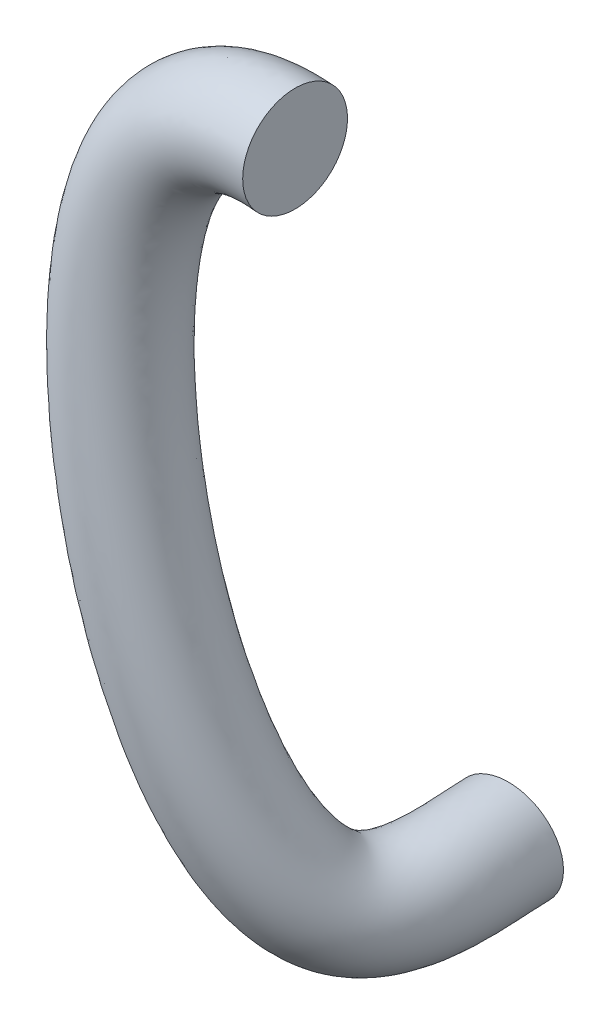
ISO-10303-21;
HEADER;
FILE_DESCRIPTION(('STEP AP214'),'2;1');
FILE_NAME('part.step','',(''),(''),'','','');
FILE_SCHEMA(('AUTOMOTIVE_DESIGN { 1 0 10303 214 1 1 1 1 }'));
ENDSEC;
DATA;
#1=APPLICATION_CONTEXT('core data for automotive mechanical design processes');
#2=APPLICATION_PROTOCOL_DEFINITION('international standard','automotive_design',2000,#1);
#3=PRODUCT_CONTEXT('',#1,'mechanical');
#4=PRODUCT('Part','Part','',(#3));
#5=PRODUCT_RELATED_PRODUCT_CATEGORY('part','',(#4));
#6=PRODUCT_DEFINITION_FORMATION('','',#4);
#7=PRODUCT_DEFINITION_CONTEXT('part definition',#1,'design');
#8=PRODUCT_DEFINITION('design','',#6,#7);
#9=PRODUCT_DEFINITION_SHAPE('','',#8);
#10=(LENGTH_UNIT() NAMED_UNIT(*) SI_UNIT(.MILLI.,.METRE.));
#11=(NAMED_UNIT(*) PLANE_ANGLE_UNIT() SI_UNIT($,.RADIAN.));
#12=(NAMED_UNIT(*) SI_UNIT($,.STERADIAN.) SOLID_ANGLE_UNIT());
#13=UNCERTAINTY_MEASURE_WITH_UNIT(LENGTH_MEASURE(1.E-05),#10,'distance_accuracy_value','');
#14=(GEOMETRIC_REPRESENTATION_CONTEXT(3) GLOBAL_UNCERTAINTY_ASSIGNED_CONTEXT((#13)) GLOBAL_UNIT_ASSIGNED_CONTEXT((#10,
#11,#12)) REPRESENTATION_CONTEXT('',''));
#15=CARTESIAN_POINT('',(0.,0.,0.));
#16=DIRECTION('',(0.,0.,1.));
#17=DIRECTION('',(1.,0.,0.));
#18=AXIS2_PLACEMENT_3D('',#15,#16,#17);
#19=CARTESIAN_POINT('',(6.71129752115392,160.69883508854,46.8977238091233));
#20=DIRECTION('',(-1.,0.,0.));
#21=DIRECTION('',(0.,0.,1.));
#22=AXIS2_PLACEMENT_3D('',#19,#20,#21);
#23=PLANE('',#22);
#24=CARTESIAN_POINT('',(6.71129752115392,160.69883508854,46.8977238091233));
#25=DIRECTION('',(-1.,0.,0.));
#26=DIRECTION('',(0.,0.,1.));
#27=AXIS2_PLACEMENT_3D('',#24,#25,#26);
#28=CIRCLE('',#27,12.0386692168077);
#29=CARTESIAN_POINT('',(6.71129752115392,160.69883508854,58.936393025931));
#30=VERTEX_POINT('',#29);
#31=EDGE_CURVE('E50',#30,#30,#28,.T.);
#32=ORIENTED_EDGE('',*,*,#31,.F.);
#33=EDGE_LOOP('',(#32));
#34=FACE_BOUND('',#33,.T.);
#35=ADVANCED_FACE('F43',(#34),#23,.F.);
#36=CARTESIAN_POINT('',(7.74999999999999,0.,-1.00000000000001));
#37=DIRECTION('',(-0.0566041118554589,0.0614817614043295,-0.996501865294629));
#38=DIRECTION('',(0.997108530409179,-0.0472044511668905,-0.0595509729162754));
#39=AXIS2_PLACEMENT_3D('',#36,#37,#38);
#40=PLANE('',#39);
#41=CARTESIAN_POINT('',(7.74999999999999,0.,-1.00000000000001));
#42=DIRECTION('',(-0.0566041118554589,0.0614817614043295,-0.996501865294629));
#43=DIRECTION('',(0.997108530409179,-0.0472044511668905,-0.0595509729162754));
#44=AXIS2_PLACEMENT_3D('',#41,#42,#43);
#45=CIRCLE('',#44,12.0386692168077);
#46=CARTESIAN_POINT('',(19.7538597708533,-0.568278773159118,-1.71691446447812));
#47=VERTEX_POINT('',#46);
#48=EDGE_CURVE('E13',#47,#47,#45,.T.);
#49=ORIENTED_EDGE('',*,*,#48,.T.);
#50=EDGE_LOOP('',(#49));
#51=FACE_BOUND('',#50,.T.);
#52=ADVANCED_FACE('F57',(#51),#40,.T.);
#53=CARTESIAN_POINT('',(6.71129752115392,160.69883508854,58.936393025931));
#54=CARTESIAN_POINT('',(2.64232080747428,161.001587531297,58.9177532654254));
#55=CARTESIAN_POINT('',(-0.944195238219384,160.721293907481,58.9756862272262));
#56=CARTESIAN_POINT('',(-5.6718689653482,159.56335363344,59.1461284701182));
#57=CARTESIAN_POINT('',(-7.13972168897522,159.054450021098,59.2168769740686));
#58=CARTESIAN_POINT('',(-9.8772485890813,157.808793214191,59.3816605110406));
#59=CARTESIAN_POINT('',(-11.1471131705001,157.07202655243,59.4757031796176));
#60=CARTESIAN_POINT('',(-13.5062232568176,155.38250036498,59.6831303658401));
#61=CARTESIAN_POINT('',(-14.5955700214568,154.429580962221,59.7965380965598));
#62=CARTESIAN_POINT('',(-16.6055529973727,152.316025551618,60.0389033687706));
#63=CARTESIAN_POINT('',(-17.5261267689097,151.155257635872,60.1678764867033));
#64=CARTESIAN_POINT('',(-20.0432382963109,147.376031073605,60.5716612986354));
#65=CARTESIAN_POINT('',(-21.3950606972365,144.458961663299,60.8636890479463));
#66=CARTESIAN_POINT('',(-23.4644206426573,137.952281202509,61.4500236417584));
#67=CARTESIAN_POINT('',(-24.1812303447294,134.363918940176,61.7442982979647));
#68=CARTESIAN_POINT('',(-25.0048657003317,126.670391864419,62.2816280706198));
#69=CARTESIAN_POINT('',(-25.1116271452532,122.56563501956,62.5247966098336));
#70=CARTESIAN_POINT('',(-24.7559396004752,113.999416955435,62.8950814115396));
#71=CARTESIAN_POINT('',(-24.2929173863005,109.538107796792,63.0220869797377));
#72=CARTESIAN_POINT('',(-23.2193305008228,102.69744875354,63.0670577455095));
#73=CARTESIAN_POINT('',(-22.7985367447473,100.392426350218,63.0576877394916));
#74=CARTESIAN_POINT('',(-22.0820834636409,96.9120907128022,62.9996312938717));
#75=CARTESIAN_POINT('',(-21.8290812586597,95.7481741785839,62.9729487750866));
#76=CARTESIAN_POINT('',(-21.4296945264029,93.998343713096,62.9210709684976));
#77=CARTESIAN_POINT('',(-21.2932535502373,93.4144072186789,62.9018034602132));
#78=CARTESIAN_POINT('',(-21.0140018901857,92.2455016144357,62.859186996318));
#79=CARTESIAN_POINT('',(-20.8686806121056,91.6609150278727,62.8342043943215));
#80=CARTESIAN_POINT('',(-20.6172762957058,90.4849092459277,62.8077278712934));
#81=CARTESIAN_POINT('',(-20.5056670156739,89.8941182849446,62.803142377095));
#82=CARTESIAN_POINT('',(-20.3101747641577,88.7063075751386,62.8119672479094));
#83=CARTESIAN_POINT('',(-20.224231059136,88.1095079291619,62.8240895618453));
#84=CARTESIAN_POINT('',(-19.942969211529,86.3189510047645,62.847508717107));
#85=CARTESIAN_POINT('',(-19.7454618103674,85.1221319377536,62.8587970449231));
#86=CARTESIAN_POINT('',(-19.1244893166395,81.5257019487116,62.8787961532288));
#87=CARTESIAN_POINT('',(-18.672544439002,79.1201362122556,62.8736247471147));
#88=CARTESIAN_POINT('',(-17.2150625785129,71.9061104959128,62.7952992215899));
#89=CARTESIAN_POINT('',(-16.1079214553012,67.1005356378372,62.6593941217392));
#90=CARTESIAN_POINT('',(-14.2924545462278,60.0001027152635,62.2999578576404));
#91=CARTESIAN_POINT('',(-13.661500399505,57.6512271364247,62.1542051604453));
#92=CARTESIAN_POINT('',(-12.6822582961877,54.1670922909851,61.892700693688));
#93=CARTESIAN_POINT('',(-12.350382213619,53.0122372909706,61.7983897964768));
#94=CARTESIAN_POINT('',(-11.8450804295128,51.2912416192519,61.6456841397449));
#95=CARTESIAN_POINT('',(-11.6754012769997,50.7194562720621,61.5929106676585));
#96=CARTESIAN_POINT('',(-11.3336658312386,49.5798931556975,61.4835291562504));
#97=CARTESIAN_POINT('',(-11.1669275515516,49.0101055191154,61.4303052896807));
#98=CARTESIAN_POINT('',(-10.794129076821,47.8886979746388,61.2963789945767));
#99=CARTESIAN_POINT('',(-10.5900178993821,47.3364375960552,61.2169344420335));
#100=CARTESIAN_POINT('',(-10.1474051943547,46.2500014930371,61.0321351128052));
#101=CARTESIAN_POINT('',(-9.90688698439704,45.7167298691711,60.9252062465005));
#102=CARTESIAN_POINT('',(-9.20300097861032,44.1185089503149,60.6090155235913));
#103=CARTESIAN_POINT('',(-8.73515207454892,43.0635245386769,60.3902624882489));
#104=CARTESIAN_POINT('',(-7.33729761228388,39.9325650131115,59.710791033785));
#105=CARTESIAN_POINT('',(-6.41307614278082,37.8905676236093,59.2269678777178));
#106=CARTESIAN_POINT('',(-3.67109980976565,31.9212032903064,57.6848269794159));
#107=CARTESIAN_POINT('',(-1.88450603224282,28.1504089561507,56.5376333459812));
#108=CARTESIAN_POINT('',(1.58954049756611,21.1407102593211,53.9729749981893));
#109=CARTESIAN_POINT('',(3.27745801313271,17.9015571939292,52.5557611936432));
#110=CARTESIAN_POINT('',(6.54997904593098,12.0729557091455,49.3607166549214));
#111=CARTESIAN_POINT('',(8.13555519444158,9.48043876956108,47.5831868774322));
#112=CARTESIAN_POINT('',(10.4307207736467,6.19813345901746,44.5245814754007));
#113=CARTESIAN_POINT('',(11.1818714781991,5.20577254863658,43.4388182669825));
#114=CARTESIAN_POINT('',(12.6487392668249,3.46119771602986,41.1129947434454));
#115=CARTESIAN_POINT('',(13.3646156184729,2.70916867674779,39.8722931696288));
#116=CARTESIAN_POINT('',(14.3997516721735,1.79789500154817,37.8862686151673));
#117=CARTESIAN_POINT('',(14.7343322288911,1.50411360450494,37.2107276877292));
#118=CARTESIAN_POINT('',(15.3887638161711,0.989751240801792,35.8156645727013));
#119=CARTESIAN_POINT('',(15.7076958524324,0.766794564098818,35.0978440079401));
#120=CARTESIAN_POINT('',(16.6317830927809,0.189235019122392,32.8914605181011));
#121=CARTESIAN_POINT('',(17.2039917254068,-0.0730817660265249,31.3503702774271));
#122=CARTESIAN_POINT('',(18.7388086702499,-0.60048297299364,26.565419343406));
#123=CARTESIAN_POINT('',(19.5202900948601,-0.606037060771934,23.1625639700975));
#124=CARTESIAN_POINT('',(20.40442080997,-0.550728924787823,15.9117521297618));
#125=CARTESIAN_POINT('',(20.4482876614725,-0.495316130494896,12.3503041893571));
#126=CARTESIAN_POINT('',(20.2411262662305,-0.457696728206301,5.33828913915522));
#127=CARTESIAN_POINT('',(19.9890497435148,-0.473732022411057,1.87545155960961));
#128=CARTESIAN_POINT('',(19.7538597708533,-0.568278773159098,-1.71691446447812));
#129=CARTESIAN_POINT('',(6.71129752115392,184.776173522156,58.936393025931));
#130=CARTESIAN_POINT('',(0.520127182955487,185.078925966144,59.0576790010119));
#131=CARTESIAN_POINT('',(-5.5971530683734,184.511785793862,59.2975121651049));
#132=CARTESIAN_POINT('',(-14.351613598672,182.055200864028,59.8552010561775));
#133=CARTESIAN_POINT('',(-17.1906455425292,180.969399617912,60.0738430610493));
#134=CARTESIAN_POINT('',(-22.5792861409768,178.284777979187,60.5702592365965));
#135=CARTESIAN_POINT('',(-25.1263733460068,176.686285679128,60.8479238509794));
#136=CARTESIAN_POINT('',(-29.8066586200073,173.080149583844,61.4469004284636));
#137=CARTESIAN_POINT('',(-31.9386493226616,171.074719262658,61.7679136709991));
#138=CARTESIAN_POINT('',(-35.7394584768988,166.803240123734,62.4354895744485));
#139=CARTESIAN_POINT('',(-37.4092348954896,164.538895574543,62.7818802046036));
#140=CARTESIAN_POINT('',(-41.7681516038707,157.542573916449,63.8405976965169));
#141=CARTESIAN_POINT('',(-43.8118564895989,152.628623178363,64.5700309947016));
#142=CARTESIAN_POINT('',(-46.6835743277109,142.709728017622,66.0576993580832));
#143=CARTESIAN_POINT('',(-47.5194360395143,137.687174770657,66.8185525407523));
#144=CARTESIAN_POINT('',(-48.3144415260155,127.562730542136,68.391565633612));
#145=CARTESIAN_POINT('',(-48.2699060266349,122.455632733435,69.2049578825947));
#146=CARTESIAN_POINT('',(-47.4228872047436,112.173709798091,70.8837493584787));
#147=CARTESIAN_POINT('',(-46.6170744809587,106.998654838481,71.7504760829907));
#148=CARTESIAN_POINT('',(-44.862297719376,99.233908805138,73.048286499925));
#149=CARTESIAN_POINT('',(-44.1859542729551,96.6456578014202,73.479930277028));
#150=CARTESIAN_POINT('',(-43.037564866358,92.7718203399245,74.1142788637555));
#151=CARTESIAN_POINT('',(-42.632474139667,91.4819766221824,74.323492748682));
#152=CARTESIAN_POINT('',(-41.9920925953536,89.5505052297966,74.632061506325));
#153=CARTESIAN_POINT('',(-41.7731772029915,88.9072307681528,74.7340394079086));
#154=CARTESIAN_POINT('',(-41.3245902172685,87.6219726126525,74.9358877575885));
#155=CARTESIAN_POINT('',(-41.0892014768666,86.9809421306277,75.0391810515011));
#156=CARTESIAN_POINT('',(-40.7075921816654,85.6847110860258,75.1798889923697));
#157=CARTESIAN_POINT('',(-40.5497645680903,85.0311930027912,75.2252853472855));
#158=CARTESIAN_POINT('',(-40.301044455471,83.7121181151197,75.2677580934628));
#159=CARTESIAN_POINT('',(-40.2055571556706,83.0472117774335,75.2676689755783));
#160=CARTESIAN_POINT('',(-39.8762464022565,81.0572490137412,75.2859928922266));
#161=CARTESIAN_POINT('',(-39.646232354536,79.7295550883907,75.2932438920654));
#162=CARTESIAN_POINT('',(-38.9263850268704,75.7455872673625,75.2991266358671));
#163=CARTESIAN_POINT('',(-38.4066982358607,73.0884363747712,75.2819416168767));
#164=CARTESIAN_POINT('',(-36.7401652005317,65.1319196488001,75.1591276747536));
#165=CARTESIAN_POINT('',(-35.4861130077169,59.8476763320257,74.9825626610972));
#166=CARTESIAN_POINT('',(-33.4329337831236,52.0242426434248,74.5396911036265));
#167=CARTESIAN_POINT('',(-32.7197971924265,49.4335538315792,74.3623256251374));
#168=CARTESIAN_POINT('',(-31.6115108538866,45.5817237103887,74.0463121978936));
#169=CARTESIAN_POINT('',(-31.2356638497147,44.3034709497948,73.9326276629152));
#170=CARTESIAN_POINT('',(-30.6627410535112,42.3956375481341,73.748848889086));
#171=CARTESIAN_POINT('',(-30.4702473944607,41.7612820260202,73.6853757982239));
#172=CARTESIAN_POINT('',(-30.0822888010772,40.4959121509362,73.5538756788076));
#173=CARTESIAN_POINT('',(-29.8989622331813,39.8619869693515,73.4779898807816));
#174=CARTESIAN_POINT('',(-29.4449125337287,38.6178697711833,73.3762763940212));
#175=CARTESIAN_POINT('',(-29.1786337344422,38.0066306338755,73.3476347011337));
#176=CARTESIAN_POINT('',(-28.5664772075453,36.8067945084743,73.3325193910159));
#177=CARTESIAN_POINT('',(-28.215391691176,36.2195399494341,73.3488109104477));
#178=CARTESIAN_POINT('',(-27.1996919789053,34.4544720661299,73.3583873224515));
#179=CARTESIAN_POINT('',(-26.5220945417767,33.2854756898254,73.345119545295));
#180=CARTESIAN_POINT('',(-24.4917541657444,29.8020119379205,73.2458332789805));
#181=CARTESIAN_POINT('',(-23.1417896807381,27.5110801768474,73.1003776588614));
#182=CARTESIAN_POINT('',(-19.1217338527458,20.7350666203925,72.4230099381548));
#183=CARTESIAN_POINT('',(-16.485803152231,16.3469936214035,71.6548165725169));
#184=CARTESIAN_POINT('',(-11.288340917565,7.83849578889125,69.4086149359347));
#185=CARTESIAN_POINT('',(-8.72563881531955,3.71517675584908,67.936845413256));
#186=CARTESIAN_POINT('',(-3.53464332965855,-4.23744762324444,63.9954906473936));
#187=CARTESIAN_POINT('',(-0.899025471242225,-8.0862543509475,61.5284956296035));
#188=CARTESIAN_POINT('',(3.23731360789066,-13.4051002173271,56.5631773257698));
#189=CARTESIAN_POINT('',(4.64658137528338,-15.0978047389488,54.6923800820608));
#190=CARTESIAN_POINT('',(7.5086138441073,-18.1797225774427,50.4316641919861));
#191=CARTESIAN_POINT('',(8.96225679911755,-19.5675112554883,48.0378388385623));
#192=CARTESIAN_POINT('',(11.1174229721981,-21.257183778912,44.0556798352529));
#193=CARTESIAN_POINT('',(11.750614559095,-21.7603471445802,42.6975580652685));
#194=CARTESIAN_POINT('',(12.9511704772793,-22.6063203575277,40.0021376252929));
#195=CARTESIAN_POINT('',(13.5127515318049,-22.9519128318819,38.6633789742138));
#196=CARTESIAN_POINT('',(15.0691410140027,-23.8005333605444,34.7152170280561));
#197=CARTESIAN_POINT('',(15.9350231758678,-24.1166343267019,32.178486645474));
#198=CARTESIAN_POINT('',(18.0362338857555,-24.6726056602602,25.0038397536858));
#199=CARTESIAN_POINT('',(18.7836024214997,-24.5563173791767,20.7997495713143));
#200=CARTESIAN_POINT('',(19.3878403213276,-24.4771684099806,13.4146599037613));
#201=CARTESIAN_POINT('',(19.3138107299234,-24.4261568170191,9.94493033552228));
#202=CARTESIAN_POINT('',(18.9923525671543,-24.4180890783904,3.31389789281658));
#203=CARTESIAN_POINT('',(18.7387730574952,-24.4578897877551,0.136623113662193));
#204=CARTESIAN_POINT('',(18.5331237278277,-24.5731766910163,-3.12861751872143));
#205=CARTESIAN_POINT('',(6.71129752115392,184.776173522156,34.8590545923157));
#206=CARTESIAN_POINT('',(0.236895255022974,185.218851702017,34.9803405673819));
#207=CARTESIAN_POINT('',(-6.23891481178911,184.757150314168,35.2264968085138));
#208=CARTESIAN_POINT('',(-15.605535772413,182.341272900062,35.8113666687035));
#209=CARTESIAN_POINT('',(-18.6597257341571,181.24947947766,36.0419971432047));
#210=CARTESIAN_POINT('',(-24.4825278375778,178.512492255791,36.5683410464237));
#211=CARTESIAN_POINT('',(-27.2482377190359,176.867653481529,36.863929647937));
#212=CARTESIAN_POINT('',(-32.3519282399417,173.139466152702,37.5035242100803));
#213=CARTESIAN_POINT('',(-34.6884989928405,171.058650824878,37.8471850242986));
#214=CARTESIAN_POINT('',(-38.8782444615499,166.625227251937,38.5633400199218));
#215=CARTESIAN_POINT('',(-40.7325020228963,164.274587089754,38.935631018124));
#216=CARTESIAN_POINT('',(-45.6237644446629,157.025417349702,40.0762888464086));
#217=CARTESIAN_POINT('',(-47.9944473181057,151.954328793055,40.865300152039));
#218=CARTESIAN_POINT('',(-51.5673116653579,141.776647335258,42.4962589663119));
#219=CARTESIAN_POINT('',(-52.778797582198,136.649948031083,43.340888969597));
#220=CARTESIAN_POINT('',(-54.4631073260889,126.339113907731,45.1400263058024));
#221=CARTESIAN_POINT('',(-54.9323802947335,121.14895632183,46.0955391324031));
#222=CARTESIAN_POINT('',(-55.3089539570998,110.680510755792,48.1742467354409));
#223=CARTESIAN_POINT('',(-55.2140716976256,105.401688819444,49.2989903985381));
#224=CARTESIAN_POINT('',(-54.6815639667656,97.4367423552493,51.1331583824465));
#225=CARTESIAN_POINT('',(-54.4381341531055,94.7743732226911,51.7686847021491));
#226=CARTESIAN_POINT('',(-53.9721570658979,90.7755297752619,52.7546216189629));
#227=CARTESIAN_POINT('',(-53.7999920973815,89.4417212293094,53.0886526282821));
#228=CARTESIAN_POINT('',(-53.5160295622969,87.4406122446746,53.5967452146001));
#229=CARTESIAN_POINT('',(-53.4170885573844,86.7735109842158,53.7672792188278));
#230=CARTESIAN_POINT('',(-53.210549999278,85.4393399919305,54.1104576426126));
#231=CARTESIAN_POINT('',(-53.102256487221,84.7724584252,54.2897922008046));
#232=CARTESIAN_POINT('',(-52.8859938026963,83.4354087146995,54.531518561517));
#233=CARTESIAN_POINT('',(-52.7774700547593,82.7656665813574,54.608075218398));
#234=CARTESIAN_POINT('',(-52.5618100861827,81.4243622110067,54.6726483824715));
#235=CARTESIAN_POINT('',(-52.4542005317348,80.7530102349093,54.6660754826698));
#236=CARTESIAN_POINT('',(-52.1206506186746,78.7414822256927,54.6842883438223));
#237=CARTESIAN_POINT('',(-51.8881643221001,77.402247966732,54.6913738144211));
#238=CARTESIAN_POINT('',(-51.1621341413508,73.3919405790925,54.6965699386226));
#239=CARTESIAN_POINT('',(-50.6400296283458,70.7282359396963,54.6787064206997));
#240=CARTESIAN_POINT('',(-48.9730211826989,62.7841629933181,54.5541872607282));
#241=CARTESIAN_POINT('',(-47.7276028809669,57.5505949624798,54.3768051546437));
#242=CARTESIAN_POINT('',(-45.7084517382899,49.8706297772489,53.9388596888578));
#243=CARTESIAN_POINT('',(-45.0101826612569,47.3391120593317,53.76418320974));
#244=CARTESIAN_POINT('',(-43.9307860840423,43.5945623960402,53.4549001453356));
#245=CARTESIAN_POINT('',(-43.5656542169261,42.3551700347035,53.3439022182807));
#246=CARTESIAN_POINT('',(-43.0106555060642,40.5105303270073,53.1650181581622));
#247=CARTESIAN_POINT('',(-42.8244396675207,39.8980590745841,53.1033175082622));
#248=CARTESIAN_POINT('',(-42.4496887460807,38.6781442561291,52.9756850776239));
#249=CARTESIAN_POINT('',(-42.262656002384,38.0718095961247,52.8951261819721));
#250=CARTESIAN_POINT('',(-41.8760079278261,36.8567824130185,52.8315355753967));
#251=CARTESIAN_POINT('',(-41.6769388939546,36.2483237103686,52.8431741083793));
#252=CARTESIAN_POINT('',(-41.2644251402231,35.0286663312221,52.952809928848));
#253=CARTESIAN_POINT('',(-41.0498059963362,34.4170018824634,53.0567205323151));
#254=CARTESIAN_POINT('',(-40.4032405609831,32.5925113363057,53.3083052089187));
#255=CARTESIAN_POINT('',(-39.9623456522376,31.3855673314284,53.4567517344707));
#256=CARTESIAN_POINT('',(-38.6142867479997,27.794765993489,53.8407034805557));
#257=CARTESIAN_POINT('',(-37.6818914153718,25.4409815432907,54.0146514517181));
#258=CARTESIAN_POINT('',(-34.8135504886917,18.5132296947712,54.2699137874465));
#259=CARTESIAN_POINT('',(-32.8098269596306,14.0732013166867,54.0857750930549));
#260=CARTESIAN_POINT('',(-28.71232020033,5.60843836153795,52.9238676510822));
#261=CARTESIAN_POINT('',(-26.6182959277646,1.58130698803799,51.9518358327092));
#262=CARTESIAN_POINT('',(-22.3313182173924,-5.98903472743217,49.0342719203764));
#263=CARTESIAN_POINT('',(-20.1329855657917,-9.54560941340249,47.0907281395889));
#264=CARTESIAN_POINT('',(-16.7207447915937,-14.3136416436348,43.1180985242251));
#265=CARTESIAN_POINT('',(-15.5641287783977,-15.8053223790084,41.6144687193114));
#266=CARTESIAN_POINT('',(-13.2321552043214,-18.4889483140357,38.1952419025811));
#267=CARTESIAN_POINT('',(-12.0562379238609,-19.6798386421262,36.2770207012842));
#268=CARTESIAN_POINT('',(-10.3223627505309,-21.1268654805469,33.0950735814438));
#269=CARTESIAN_POINT('',(-9.82112329383935,-21.5062979227343,32.0006740270031));
#270=CARTESIAN_POINT('',(-8.88847594043717,-22.1375470261023,29.8711041620472));
#271=CARTESIAN_POINT('',(-8.46101333064735,-22.3873948906423,28.8310706239684));
#272=CARTESIAN_POINT('',(-7.29913223451319,-22.984055411056,25.8159879380775));
#273=CARTESIAN_POINT('',(-6.68531765585224,-23.1811659835517,23.9497266613275));
#274=CARTESIAN_POINT('',(-5.26598096851374,-23.4950561009834,18.8772479839728));
#275=CARTESIAN_POINT('',(-4.875454269282,-23.3705293097982,16.190246738236));
#276=CARTESIAN_POINT('',(-4.6870893055554,-23.3157999844586,12.1220841338555));
#277=CARTESIAN_POINT('',(-4.7464923642929,-23.282898870516,9.86340646232996));
#278=CARTESIAN_POINT('',(-5.03207944309497,-23.2833164523808,4.63708630664171));
#279=CARTESIAN_POINT('',(-5.26231785223441,-23.3170081966695,1.678012859249));
#280=CARTESIAN_POINT('',(-5.47459581387888,-23.436619144698,-1.6947885897652));
#281=CARTESIAN_POINT('',(6.71129752115392,160.69883508854,34.8590545923157));
#282=CARTESIAN_POINT('',(2.35908887954177,161.141513267169,34.8404148317954));
#283=CARTESIAN_POINT('',(-1.58595698163508,160.966658427786,34.9046708706291));
#284=CARTESIAN_POINT('',(-6.92579113908913,159.849425669475,35.1022940826472));
#285=CARTESIAN_POINT('',(-8.60880188060313,159.334529880835,35.1850310562296));
#286=CARTESIAN_POINT('',(-11.7804902856823,158.036507490806,35.3797423208623));
#287=CARTESIAN_POINT('',(-13.2689775435239,157.253394354841,35.4917089765807));
#288=CARTESIAN_POINT('',(-16.0514928767575,155.441816933828,35.7397541474513));
#289=CARTESIAN_POINT('',(-17.3454196916357,154.41351252443,35.8758094498567));
#290=CARTESIAN_POINT('',(-19.7443389820238,152.138012679831,36.1667538142466));
#291=CARTESIAN_POINT('',(-20.8493938963108,150.890949151083,36.3216273002265));
#292=CARTESIAN_POINT('',(-23.8988511371142,146.858874506858,36.8073524485216));
#293=CARTESIAN_POINT('',(-25.5776515257311,143.784667278015,37.1589582052775));
#294=CARTESIAN_POINT('',(-28.3481579803167,137.019200520121,37.8885832499933));
#295=CARTESIAN_POINT('',(-29.440591887372,133.326692200602,38.266634726782));
#296=CARTESIAN_POINT('',(-31.1535315004463,125.446775230014,39.0300887428376));
#297=CARTESIAN_POINT('',(-31.7741014133367,121.258958607941,39.415377859642));
#298=CARTESIAN_POINT('',(-32.6420063528464,112.506217913152,40.1855787885019));
#299=CARTESIAN_POINT('',(-32.8899146029674,107.941141777755,40.5706012953415));
#300=CARTESIAN_POINT('',(-33.0385967482124,100.900282303651,41.1519296280028));
#301=CARTESIAN_POINT('',(-33.0507166248894,98.5211417714973,41.3464421646003));
#302=CARTESIAN_POINT('',(-33.0166756631849,94.9158001481354,41.6399740490852));
#303=CARTESIAN_POINT('',(-32.9965992163699,93.7079187857068,41.7381086546826));
#304=CARTESIAN_POINT('',(-32.9536314933482,91.8884507279762,41.8857546767747));
#305=CARTESIAN_POINT('',(-32.9371649046302,91.2806874347419,41.9350432711281));
#306=CARTESIAN_POINT('',(-32.8999616721952,90.0628689937136,42.0337568813463));
#307=CARTESIAN_POINT('',(-32.8817356224642,89.452431322445,42.0848155436271));
#308=CARTESIAN_POINT('',(-32.7956779167325,88.2356068746014,42.1593574404386));
#309=CARTESIAN_POINT('',(-32.7333725023407,87.6285918635129,42.1859322482097));
#310=CARTESIAN_POINT('',(-32.5709403948715,86.4185516710235,42.216857536916));
#311=CARTESIAN_POINT('',(-32.4728744351937,85.8153063866377,42.2224960689388));
#312=CARTESIAN_POINT('',(-32.1873734279596,84.0031842167161,42.2458041686984));
#313=CARTESIAN_POINT('',(-31.9873937779399,82.794824816095,42.2569269672788));
#314=CARTESIAN_POINT('',(-31.3602384311029,79.1720552604417,42.2762394559844));
#315=CARTESIAN_POINT('',(-30.9058758314957,76.7599357771892,42.2703895509717));
#316=CARTESIAN_POINT('',(-29.4479185606631,69.5583538404137,42.1903588074964));
#317=CARTESIAN_POINT('',(-28.3494113285344,64.8034542682829,42.0536366152352));
#318=CARTESIAN_POINT('',(-26.5679725014025,57.8464898490918,41.6991264428969));
#319=CARTESIAN_POINT('',(-25.9518858683436,55.5567853641731,41.5560627450479));
#320=CARTESIAN_POINT('',(-25.0015335263393,52.1799309766386,41.30128864113));
#321=CARTESIAN_POINT('',(-24.6803725808386,51.0639363758794,41.2096643518464));
#322=CARTESIAN_POINT('',(-24.1929948820617,49.4061343981251,41.061853408819));
#323=CARTESIAN_POINT('',(-24.0295935500658,48.856233320623,41.0108523776987));
#324=CARTESIAN_POINT('',(-23.701065776236,47.7621252608934,40.9053385550646));
#325=CARTESIAN_POINT('',(-23.5306213207543,47.2199281458866,40.8474415908712));
#326=CARTESIAN_POINT('',(-23.2252244709184,46.1276106164761,40.7516381759523));
#327=CARTESIAN_POINT('',(-23.0883230588965,45.5781306725463,40.7124738492812));
#328=CARTESIAN_POINT('',(-22.8453531270304,44.4718733157869,40.6524256506353));
#329=CARTESIAN_POINT('',(-22.7413012895553,43.9141918021974,40.6331158683679));
#330=CARTESIAN_POINT('',(-22.4065495606921,42.2565482204966,40.5589334100585));
#331=CARTESIAN_POINT('',(-22.1754031850059,41.1636161802857,40.5018946774246));
#332=CARTESIAN_POINT('',(-21.459830194547,37.9253190686682,40.3056612353601));
#333=CARTESIAN_POINT('',(-20.9531778774108,35.8204689900338,40.1412416705669));
#334=CARTESIAN_POINT('',(-19.3629164457192,29.6993663647227,39.5317308287226));
#335=CARTESIAN_POINT('',(-18.2085298396289,25.8766166514204,38.9685918665463));
#336=CARTESIAN_POINT('',(-15.8344387852126,18.9106528319814,37.4882277133096));
#337=CARTESIAN_POINT('',(-14.6151990993123,15.7676874261181,36.5707516130727));
#338=CARTESIAN_POINT('',(-12.2466958418029,10.3213686049577,34.399497927928));
#339=CARTESIAN_POINT('',(-11.0984049001079,8.02108370709595,33.1454193874177));
#340=CARTESIAN_POINT('',(-9.52733762583772,5.28959203271487,31.079502673856));
#341=CARTESIAN_POINT('',(-9.02883867548322,4.49825490857698,30.3609069042331));
#342=CARTESIAN_POINT('',(-8.09202978160255,3.15197197943683,28.8765724540405));
#343=CARTESIAN_POINT('',(-7.65387910450778,2.59684129010989,28.1114750323576));
#344=CARTESIAN_POINT('',(-7.04003405055428,1.92821329991331,26.9256623613548));
#345=CARTESIAN_POINT('',(-6.8374056240433,1.75816282635076,26.5138436494626));
#346=CARTESIAN_POINT('',(-6.45088260154539,1.45852457222719,25.6846311094567));
#347=CARTESIAN_POINT('',(-6.26606901001932,1.33131250533842,25.2655356576947));
#348=CARTESIAN_POINT('',(-5.73649015573613,1.00571296861084,23.9922314281224));
#349=CARTESIAN_POINT('',(-5.41634910631093,0.862386577123723,23.1216102932794));
#350=CARTESIAN_POINT('',(-4.56340618402397,0.577066586283218,20.4388275736953));
#351=CARTESIAN_POINT('',(-4.13876659592634,0.579751008606628,18.5530611370192));
#352=CARTESIAN_POINT('',(-3.67050881690802,0.61063950073426,14.619176359856));
#353=CARTESIAN_POINT('',(-3.61201543274382,0.647941816008202,12.268780316162));
#354=CARTESIAN_POINT('',(-3.78330574401877,0.677075897803237,6.6614775529831));
#355=CARTESIAN_POINT('',(-4.012041166218,0.667149568674518,3.41684130519879));
#356=CARTESIAN_POINT('',(-4.25385977085331,0.568278773159181,-0.283085535521898));
#357=CARTESIAN_POINT('',(6.71129752115392,136.621496654925,34.8590545923157));
#358=CARTESIAN_POINT('',(4.48128250406057,137.064174832322,34.700489096209));
#359=CARTESIAN_POINT('',(3.06700084851895,137.176166541405,34.5828449327444));
#360=CARTESIAN_POINT('',(1.75395349423472,137.357578438887,34.3932214965909));
#361=CARTESIAN_POINT('',(1.44212197295085,137.41958028401,34.3280649692545));
#362=CARTESIAN_POINT('',(0.921547266213211,137.560522725822,34.1911435953009));
#363=CARTESIAN_POINT('',(0.710282631988169,137.639135228154,34.1194883052243));
#364=CARTESIAN_POINT('',(0.248942486426811,137.744167714954,33.9759840848224));
#365=CARTESIAN_POINT('',(-0.00234039043101508,137.768374223982,33.9044338754147));
#366=CARTESIAN_POINT('',(-0.610433502497616,137.650798107726,33.7701676085715));
#367=CARTESIAN_POINT('',(-0.966285769725349,137.507311212411,33.707623582329));
#368=CARTESIAN_POINT('',(-2.17393782956545,136.692331664014,33.5384160506345));
#369=CARTESIAN_POINT('',(-3.16085573335643,135.615005762976,33.4526162585161));
#370=CARTESIAN_POINT('',(-5.12900429527539,132.261753704983,33.2809075336747));
#371=CARTESIAN_POINT('',(-6.10238619254595,130.003436370121,33.1923804839669));
#372=CARTESIAN_POINT('',(-7.84395567480371,124.554436552297,32.9201511798728));
#373=CARTESIAN_POINT('',(-8.61582253193997,121.368960894052,32.7352165868809));
#374=CARTESIAN_POINT('',(-9.97505874859307,114.331925070511,32.1969108415628));
#375=CARTESIAN_POINT('',(-10.5657575083091,110.480594736066,31.842212192145));
#376=CARTESIAN_POINT('',(-11.3956295296592,104.363822252054,31.1707008735591));
#377=CARTESIAN_POINT('',(-11.6632990966734,102.267910320303,30.9241996270514));
#378=CARTESIAN_POINT('',(-12.061194260472,99.0560705210089,30.5253264792075));
#379=CARTESIAN_POINT('',(-12.1932063353584,97.9741163421041,30.387564681083));
#380=CARTESIAN_POINT('',(-12.3912334243996,96.3362892112778,30.1747641389494));
#381=CARTESIAN_POINT('',(-12.457241251876,95.787863885268,30.1028073234285));
#382=CARTESIAN_POINT('',(-12.5893733451124,94.6863979954967,29.95705612008));
#383=CARTESIAN_POINT('',(-12.6612147577074,94.1324042196899,29.8798388864496));
#384=CARTESIAN_POINT('',(-12.7053620307687,93.0358050345034,29.7871963193603));
#385=CARTESIAN_POINT('',(-12.6892749499223,92.4915171456684,29.7637892780213));
#386=CARTESIAN_POINT('',(-12.5800707035604,91.4127411310403,29.7610666913605));
#387=CARTESIAN_POINT('',(-12.4915483386528,90.8776025383662,29.7789166552079));
#388=CARTESIAN_POINT('',(-12.2540962372447,89.2648862077394,29.8073199935745));
#389=CARTESIAN_POINT('',(-12.0866232337799,88.187401665458,29.8224801201365));
#390=CARTESIAN_POINT('',(-11.558342720855,84.9521699417909,29.8559089733461));
#391=CARTESIAN_POINT('',(-11.1717220346455,82.7916356146821,29.8620726812438));
#392=CARTESIAN_POINT('',(-9.92281593862732,76.3325446875094,29.8265303542647));
#393=CARTESIAN_POINT('',(-8.97121977610195,72.056313574086,29.7304680758267));
#394=CARTESIAN_POINT('',(-7.4274932645151,65.8223499209347,29.459393196936));
#395=CARTESIAN_POINT('',(-6.89358907543035,63.7744586690145,29.3479422803557));
#396=CARTESIAN_POINT('',(-6.07228096863621,60.765299557237,29.1476771369243));
#397=CARTESIAN_POINT('',(-5.79509094475105,59.7727027170552,29.075426485412));
#398=CARTESIAN_POINT('',(-5.37533425805925,58.301738469243,28.9586886594758));
#399=CARTESIAN_POINT('',(-5.23474743261085,57.8144075666619,28.9183872471353));
#400=CARTESIAN_POINT('',(-4.95244280639137,56.8461062656578,28.8349920325054));
#401=CARTESIAN_POINT('',(-4.7985866391246,56.3680466956485,28.7997569997702));
#402=CARTESIAN_POINT('',(-4.57444101401071,55.3984388199338,28.6717407765078));
#403=CARTESIAN_POINT('',(-4.4997072238384,54.9079376347239,28.581773590183));
#404=CARTESIAN_POINT('',(-4.42628111383768,53.9150803003517,28.3520413724226));
#405=CARTESIAN_POINT('',(-4.43279658277433,53.4113817219315,28.2095112044207));
#406=CARTESIAN_POINT('',(-4.40985856040106,51.9205851046876,27.8095616111982));
#407=CARTESIAN_POINT('',(-4.38846071777417,50.9416650291429,27.5470376203785));
#408=CARTESIAN_POINT('',(-4.30537364109432,48.0558721438474,26.7706189901646));
#409=CARTESIAN_POINT('',(-4.22446433944973,46.1999564367769,26.2678318894158));
#410=CARTESIAN_POINT('',(-3.91228240274662,40.8855030346743,24.7935478699988));
#411=CARTESIAN_POINT('',(-3.60723271962714,37.680031986154,23.8514086400377));
#412=CARTESIAN_POINT('',(-2.95655737009511,32.2128673024249,22.052587775537));
#413=CARTESIAN_POINT('',(-2.61210227086007,29.9540678641983,21.1896673934362));
#414=CARTESIAN_POINT('',(-2.16207346621342,26.6317719373477,19.7647239354795));
#415=CARTESIAN_POINT('',(-2.0638242344241,25.5877768275944,19.2001106352464));
#416=CARTESIAN_POINT('',(-2.33393046008173,24.8928257090645,19.0409068234869));
#417=CARTESIAN_POINT('',(-2.4935485725687,24.8018321961623,19.1073450891549));
#418=CARTESIAN_POINT('',(-2.95190435888372,24.7928922729094,19.5579030054999));
#419=CARTESIAN_POINT('',(-3.25152028515466,24.873521222346,19.9459293634309));
#420=CARTESIAN_POINT('',(-3.75770535057771,24.9832920803735,20.7562511412657));
#421=CARTESIAN_POINT('',(-3.85368795424726,25.0226235754359,21.0270132719222));
#422=CARTESIAN_POINT('',(-4.0132892626536,25.0545961705566,21.4981580568662));
#423=CARTESIAN_POINT('',(-4.07112468939128,25.0500199013192,21.700000691421));
#424=CARTESIAN_POINT('',(-4.17384807695908,24.9954813482777,22.1684749181674));
#425=CARTESIAN_POINT('',(-4.14738055676962,24.9059391377991,22.2934939252314));
#426=CARTESIAN_POINT('',(-3.86083139953419,24.6491892735498,22.0004071634178));
#427=CARTESIAN_POINT('',(-3.40207892257068,24.5300313270114,20.9158755358024));
#428=CARTESIAN_POINT('',(-2.65392832826065,24.5370789859271,17.1162685858565));
#429=CARTESIAN_POINT('',(-2.47753850119474,24.5787825025324,14.674154169994));
#430=CARTESIAN_POINT('',(-2.53453204494256,24.6374682479873,8.68586879932448));
#431=CARTESIAN_POINT('',(-2.76176448020159,24.6513073340185,5.15566975114858));
#432=CARTESIAN_POINT('',(-3.03312372782773,24.5731766910164,1.12861751872141));
#433=CARTESIAN_POINT('',(6.71129752115392,136.621496654925,58.936393025931));
#434=CARTESIAN_POINT('',(4.76451443199308,136.92424909645,58.7778275298389));
#435=CARTESIAN_POINT('',(3.70876259193465,136.930802021099,58.6538602893474));
#436=CARTESIAN_POINT('',(3.00787566797566,137.071506402853,58.4370558840589));
#437=CARTESIAN_POINT('',(2.91120216457875,137.139500424284,58.3599108870879));
#438=CARTESIAN_POINT('',(2.82478896281421,137.332808449196,58.1930617854848));
#439=CARTESIAN_POINT('',(2.83214700500647,137.457767425732,58.1034825082559));
#440=CARTESIAN_POINT('',(2.7942121063721,137.684851146117,57.9193603032165));
#441=CARTESIAN_POINT('',(2.74750927974787,137.784442661784,57.8251625221206));
#442=CARTESIAN_POINT('',(2.52835248215347,137.828810979502,57.6423171630927));
#443=CARTESIAN_POINT('',(2.35698135767022,137.7716196972,57.553872768803));
#444=CARTESIAN_POINT('',(1.68167501124899,137.209488230761,57.302724900754));
#445=CARTESIAN_POINT('',(1.02173509512576,136.289300148235,57.157347101191));
#446=CARTESIAN_POINT('',(-0.245266957603738,133.194834387396,56.8423479254337));
#447=CARTESIAN_POINT('',(-0.843024649944607,131.040663109694,56.6700440551772));
#448=CARTESIAN_POINT('',(-1.69528987464789,125.778053186702,56.1716905076275));
#449=CARTESIAN_POINT('',(-1.95334826387157,122.675637305686,55.8446353370726));
#450=CARTESIAN_POINT('',(-2.08899199620678,115.825124112779,54.9064134646006));
#451=CARTESIAN_POINT('',(-1.96876029164224,112.077560755103,54.2936978764848));
#452=CARTESIAN_POINT('',(-1.57636328226961,106.160988701942,53.085828991094));
#453=CARTESIAN_POINT('',(-1.4111192165395,104.139194899016,52.6354452019551));
#454=CARTESIAN_POINT('',(-1.12660206092389,101.05236108568,51.8849837239878));
#455=CARTESIAN_POINT('',(-1.02568837765233,100.014371734985,51.6224048014913));
#456=CARTESIAN_POINT('',(-0.867296457452174,98.4461821963955,51.2100804306702));
#457=CARTESIAN_POINT('',(-0.813329897483074,97.9215836692049,51.0695675125177));
#458=CARTESIAN_POINT('',(-0.703413563102872,96.8690306162188,50.7824862350475));
#459=CARTESIAN_POINT('',(-0.64815974734458,96.3408879251176,50.6292277371419));
#460=CARTESIAN_POINT('',(-0.526960409746234,95.2851074058296,50.4355667502172));
#461=CARTESIAN_POINT('',(-0.461569463257531,94.757043567098,50.3809994069046));
#462=CARTESIAN_POINT('',(-0.319305072844507,93.7004970351575,50.356176402356));
#463=CARTESIAN_POINT('',(-0.242904962601295,93.1718040808904,50.3805101481123));
#464=CARTESIAN_POINT('',(-0.00969202080137636,91.5806529957879,50.4090245419873));
#465=CARTESIAN_POINT('',(0.155308733801109,90.5147087871166,50.4243501977808));
#466=CARTESIAN_POINT('',(0.677406393591431,87.3058166300608,50.4584656705905));
#467=CARTESIAN_POINT('',(1.06160935785672,85.15183604974,50.4653078773527));
#468=CARTESIAN_POINT('',(2.3100400435059,78.6803013430255,50.4314707684261));
#469=CARTESIAN_POINT('',(3.27027009711441,74.3533949436488,50.336225582381));
#470=CARTESIAN_POINT('',(4.84802469066799,67.9759627871023,50.0602246116543));
#471=CARTESIAN_POINT('',(5.39679639341657,65.8689004412702,49.9460846957531));
#472=CARTESIAN_POINT('',(6.24699426151126,62.7524608715815,49.7390891894823));
#473=CARTESIAN_POINT('',(6.53489942247671,61.7210036321465,49.6641519300383));
#474=CARTESIAN_POINT('',(6.97258019448564,60.1868456903698,49.5425193904037));
#475=CARTESIAN_POINT('',(7.11944484046134,59.6776305181041,49.500445537093));
#476=CARTESIAN_POINT('',(7.41495713859994,58.6638741604588,49.4131826336932));
#477=CARTESIAN_POINT('',(7.56510713007806,58.1582240688793,49.3826206985798));
#478=CARTESIAN_POINT('',(7.85665438008671,57.1595261780945,49.2164815951323));
#479=CARTESIAN_POINT('',(7.998597935678,56.6662445582349,49.0862341829334));
#480=CARTESIAN_POINT('',(8.27166681883607,55.6932084775999,48.7317508345946));
#481=CARTESIAN_POINT('',(8.40161772238192,55.2139197889081,48.5016015825533));
#482=CARTESIAN_POINT('',(8.79369002168467,53.7825458344999,47.8596437247311));
#483=CARTESIAN_POINT('',(9.05179039267888,52.8415733875283,47.4354054312028));
#484=CARTESIAN_POINT('',(9.81715894117666,50.0631180883024,46.1757487885894));
#485=CARTESIAN_POINT('',(10.3156373951764,48.2700550703712,45.3535580965741));
#486=CARTESIAN_POINT('',(11.7795342332144,43.1073399602204,42.946644020677));
#487=CARTESIAN_POINT('',(12.7167910877453,39.953824290898,41.4204501194454));
#488=CARTESIAN_POINT('',(14.4674219126972,34.442924729751,38.5373350604439));
#489=CARTESIAN_POINT('',(15.280554841585,32.0879376320094,37.1746769740305));
#490=CARTESIAN_POINT('',(16.6346014215205,28.3833590415354,34.7259426624492));
#491=CARTESIAN_POINT('',(17.1701358601254,27.0471318900697,33.637878125261));
#492=CARTESIAN_POINT('',(17.6241279394026,25.801367135362,32.4859856250316));
#493=CARTESIAN_POINT('',(17.7171615811148,25.5093498362219,32.1852564519042));
#494=CARTESIAN_POINT('',(17.7888646895426,25.1021180095024,31.7943252949048));
#495=CARTESIAN_POINT('',(17.7669744378283,24.9858486089839,31.7067475006954));
#496=CARTESIAN_POINT('',(17.6820803721489,24.8529737820084,31.7168573950816));
#497=CARTESIAN_POINT('',(17.7180498986871,24.76857435359,31.7238973101899));
#498=CARTESIAN_POINT('',(17.8263571550629,24.5858228391312,31.6291915201096));
#499=CARTESIAN_POINT('',(17.9026401730599,24.4855019600796,31.5323090416664));
#500=CARTESIAN_POINT('',(18.1944251715591,24.1790033987892,31.067704008146));
#501=CARTESIAN_POINT('',(18.4729602749458,23.9704707946488,30.5222539093802));
#502=CARTESIAN_POINT('',(19.4413834547442,23.4716397142729,28.1269989331262));
#503=CARTESIAN_POINT('',(20.2569777682206,23.3442432576328,25.5253783688806));
#504=CARTESIAN_POINT('',(21.4210012986124,23.375710560405,18.4088443557623));
#505=CARTESIAN_POINT('',(21.5827645930215,23.4355245560293,14.7556780431919));
#506=CARTESIAN_POINT('',(21.4898999653067,23.5026956219778,7.36268038549387));
#507=CARTESIAN_POINT('',(21.2393264295344,23.5104257429329,3.61428000555702));
#508=CARTESIAN_POINT('',(20.9745958138789,23.4366191446981,-0.305211410234812));
#509=CARTESIAN_POINT('',(6.71129752115392,160.69883508854,58.936393025931));
#510=CARTESIAN_POINT('',(2.64232080747428,161.001587531297,58.9177532654254));
#511=CARTESIAN_POINT('',(-0.944195238219384,160.721293907481,58.9756862272262));
#512=CARTESIAN_POINT('',(-5.6718689653482,159.56335363344,59.1461284701182));
#513=CARTESIAN_POINT('',(-7.13972168897522,159.054450021098,59.2168769740686));
#514=CARTESIAN_POINT('',(-9.8772485890813,157.808793214191,59.3816605110406));
#515=CARTESIAN_POINT('',(-11.1471131705001,157.07202655243,59.4757031796176));
#516=CARTESIAN_POINT('',(-13.5062232568176,155.38250036498,59.6831303658401));
#517=CARTESIAN_POINT('',(-14.5955700214568,154.429580962221,59.7965380965598));
#518=CARTESIAN_POINT('',(-16.6055529973727,152.316025551618,60.0389033687706));
#519=CARTESIAN_POINT('',(-17.5261267689097,151.155257635872,60.1678764867033));
#520=CARTESIAN_POINT('',(-20.0432382963109,147.376031073605,60.5716612986354));
#521=CARTESIAN_POINT('',(-21.3950606972365,144.458961663299,60.8636890479463));
#522=CARTESIAN_POINT('',(-23.4644206426573,137.952281202509,61.4500236417584));
#523=CARTESIAN_POINT('',(-24.1812303447294,134.363918940176,61.7442982979647));
#524=CARTESIAN_POINT('',(-25.0048657003317,126.670391864419,62.2816280706198));
#525=CARTESIAN_POINT('',(-25.1116271452532,122.56563501956,62.5247966098336));
#526=CARTESIAN_POINT('',(-24.7559396004752,113.999416955435,62.8950814115396));
#527=CARTESIAN_POINT('',(-24.2929173863005,109.538107796792,63.0220869797377));
#528=CARTESIAN_POINT('',(-23.2193305008228,102.69744875354,63.0670577455095));
#529=CARTESIAN_POINT('',(-22.7985367447473,100.392426350218,63.0576877394916));
#530=CARTESIAN_POINT('',(-22.0820834636409,96.9120907128022,62.9996312938717));
#531=CARTESIAN_POINT('',(-21.8290812586597,95.7481741785839,62.9729487750866));
#532=CARTESIAN_POINT('',(-21.4296945264029,93.998343713096,62.9210709684976));
#533=CARTESIAN_POINT('',(-21.2932535502373,93.4144072186789,62.9018034602132));
#534=CARTESIAN_POINT('',(-21.0140018901857,92.2455016144357,62.859186996318));
#535=CARTESIAN_POINT('',(-20.8686806121056,91.6609150278727,62.8342043943215));
#536=CARTESIAN_POINT('',(-20.6172762957058,90.4849092459277,62.8077278712934));
#537=CARTESIAN_POINT('',(-20.5056670156739,89.8941182849446,62.803142377095));
#538=CARTESIAN_POINT('',(-20.3101747641577,88.7063075751386,62.8119672479094));
#539=CARTESIAN_POINT('',(-20.224231059136,88.1095079291619,62.8240895618453));
#540=CARTESIAN_POINT('',(-19.942969211529,86.3189510047645,62.847508717107));
#541=CARTESIAN_POINT('',(-19.7454618103674,85.1221319377536,62.8587970449231));
#542=CARTESIAN_POINT('',(-19.1244893166395,81.5257019487116,62.8787961532288));
#543=CARTESIAN_POINT('',(-18.672544439002,79.1201362122556,62.8736247471147));
#544=CARTESIAN_POINT('',(-17.2150625785129,71.9061104959128,62.7952992215899));
#545=CARTESIAN_POINT('',(-16.1079214553012,67.1005356378372,62.6593941217392));
#546=CARTESIAN_POINT('',(-14.2924545462278,60.0001027152635,62.2999578576404));
#547=CARTESIAN_POINT('',(-13.661500399505,57.6512271364247,62.1542051604453));
#548=CARTESIAN_POINT('',(-12.6822582961877,54.1670922909851,61.892700693688));
#549=CARTESIAN_POINT('',(-12.350382213619,53.0122372909706,61.7983897964768));
#550=CARTESIAN_POINT('',(-11.8450804295128,51.2912416192519,61.6456841397449));
#551=CARTESIAN_POINT('',(-11.6754012769997,50.7194562720621,61.5929106676585));
#552=CARTESIAN_POINT('',(-11.3336658312386,49.5798931556975,61.4835291562504));
#553=CARTESIAN_POINT('',(-11.1669275515516,49.0101055191154,61.4303052896807));
#554=CARTESIAN_POINT('',(-10.794129076821,47.8886979746388,61.2963789945767));
#555=CARTESIAN_POINT('',(-10.5900178993821,47.3364375960552,61.2169344420335));
#556=CARTESIAN_POINT('',(-10.1474051943547,46.2500014930371,61.0321351128052));
#557=CARTESIAN_POINT('',(-9.90688698439704,45.7167298691711,60.9252062465005));
#558=CARTESIAN_POINT('',(-9.20300097861032,44.1185089503149,60.6090155235913));
#559=CARTESIAN_POINT('',(-8.73515207454892,43.0635245386769,60.3902624882489));
#560=CARTESIAN_POINT('',(-7.33729761228388,39.9325650131115,59.710791033785));
#561=CARTESIAN_POINT('',(-6.41307614278082,37.8905676236093,59.2269678777178));
#562=CARTESIAN_POINT('',(-3.67109980976565,31.9212032903064,57.6848269794159));
#563=CARTESIAN_POINT('',(-1.88450603224282,28.1504089561507,56.5376333459812));
#564=CARTESIAN_POINT('',(1.58954049756611,21.1407102593211,53.9729749981893));
#565=CARTESIAN_POINT('',(3.27745801313271,17.9015571939292,52.5557611936432));
#566=CARTESIAN_POINT('',(6.54997904593098,12.0729557091455,49.3607166549214));
#567=CARTESIAN_POINT('',(8.13555519444158,9.48043876956108,47.5831868774322));
#568=CARTESIAN_POINT('',(10.4307207736467,6.19813345901746,44.5245814754007));
#569=CARTESIAN_POINT('',(11.1818714781991,5.20577254863658,43.4388182669825));
#570=CARTESIAN_POINT('',(12.6487392668249,3.46119771602986,41.1129947434454));
#571=CARTESIAN_POINT('',(13.3646156184729,2.70916867674779,39.8722931696288));
#572=CARTESIAN_POINT('',(14.3997516721735,1.79789500154817,37.8862686151673));
#573=CARTESIAN_POINT('',(14.7343322288911,1.50411360450494,37.2107276877292));
#574=CARTESIAN_POINT('',(15.3887638161711,0.989751240801792,35.8156645727013));
#575=CARTESIAN_POINT('',(15.7076958524324,0.766794564098818,35.0978440079401));
#576=CARTESIAN_POINT('',(16.6317830927809,0.189235019122392,32.8914605181011));
#577=CARTESIAN_POINT('',(17.2039917254068,-0.0730817660265249,31.3503702774271));
#578=CARTESIAN_POINT('',(18.7388086702499,-0.60048297299364,26.565419343406));
#579=CARTESIAN_POINT('',(19.5202900948601,-0.606037060771934,23.1625639700975));
#580=CARTESIAN_POINT('',(20.40442080997,-0.550728924787823,15.9117521297618));
#581=CARTESIAN_POINT('',(20.4482876614725,-0.495316130494896,12.3503041893571));
#582=CARTESIAN_POINT('',(20.2411262662305,-0.457696728206301,5.33828913915522));
#583=CARTESIAN_POINT('',(19.9890497435148,-0.473732022411057,1.87545155960961));
#584=CARTESIAN_POINT('',(19.7538597708533,-0.568278773159098,-1.71691446447812));
#585=(BOUNDED_SURFACE() B_SPLINE_SURFACE(3,3,((#53,#54,#55,#56,#57,#58,#59,#60,#61,#62,#63,#64,
#65,#66,#67,#68,#69,#70,#71,#72,#73,#74,#75,#76,#77,#78,#79,#80,#81,#82,#83,#84,#85,#86,#87,#88,
#89,#90,#91,#92,#93,#94,#95,#96,#97,#98,#99,#100,#101,#102,#103,#104,#105,#106,#107,#108,#109,
#110,#111,#112,#113,#114,#115,#116,#117,#118,#119,#120,#121,#122,#123,#124,#125,#126,#127,#128),
(#129,#130,#131,#132,#133,#134,#135,#136,#137,#138,#139,#140,#141,#142,#143,#144,#145,#146,#147,
#148,#149,#150,#151,#152,#153,#154,#155,#156,#157,#158,#159,#160,#161,#162,#163,#164,#165,#166,
#167,#168,#169,#170,#171,#172,#173,#174,#175,#176,#177,#178,#179,#180,#181,#182,#183,#184,#185,
#186,#187,#188,#189,#190,#191,#192,#193,#194,#195,#196,#197,#198,#199,#200,#201,#202,#203,#204),
(#205,#206,#207,#208,#209,#210,#211,#212,#213,#214,#215,#216,#217,#218,#219,#220,#221,#222,#223,
#224,#225,#226,#227,#228,#229,#230,#231,#232,#233,#234,#235,#236,#237,#238,#239,#240,#241,#242,
#243,#244,#245,#246,#247,#248,#249,#250,#251,#252,#253,#254,#255,#256,#257,#258,#259,#260,#261,
#262,#263,#264,#265,#266,#267,#268,#269,#270,#271,#272,#273,#274,#275,#276,#277,#278,#279,#280),
(#281,#282,#283,#284,#285,#286,#287,#288,#289,#290,#291,#292,#293,#294,#295,#296,#297,#298,#299,
#300,#301,#302,#303,#304,#305,#306,#307,#308,#309,#310,#311,#312,#313,#314,#315,#316,#317,#318,
#319,#320,#321,#322,#323,#324,#325,#326,#327,#328,#329,#330,#331,#332,#333,#334,#335,#336,#337,
#338,#339,#340,#341,#342,#343,#344,#345,#346,#347,#348,#349,#350,#351,#352,#353,#354,#355,#356),
(#357,#358,#359,#360,#361,#362,#363,#364,#365,#366,#367,#368,#369,#370,#371,#372,#373,#374,#375,
#376,#377,#378,#379,#380,#381,#382,#383,#384,#385,#386,#387,#388,#389,#390,#391,#392,#393,#394,
#395,#396,#397,#398,#399,#400,#401,#402,#403,#404,#405,#406,#407,#408,#409,#410,#411,#412,#413,
#414,#415,#416,#417,#418,#419,#420,#421,#422,#423,#424,#425,#426,#427,#428,#429,#430,#431,#432),
(#433,#434,#435,#436,#437,#438,#439,#440,#441,#442,#443,#444,#445,#446,#447,#448,#449,#450,#451,
#452,#453,#454,#455,#456,#457,#458,#459,#460,#461,#462,#463,#464,#465,#466,#467,#468,#469,#470,
#471,#472,#473,#474,#475,#476,#477,#478,#479,#480,#481,#482,#483,#484,#485,#486,#487,#488,#489,
#490,#491,#492,#493,#494,#495,#496,#497,#498,#499,#500,#501,#502,#503,#504,#505,#506,#507,#508),
(#509,#510,#511,#512,#513,#514,#515,#516,#517,#518,#519,#520,#521,#522,#523,#524,#525,#526,#527,
#528,#529,#530,#531,#532,#533,#534,#535,#536,#537,#538,#539,#540,#541,#542,#543,#544,#545,#546,
#547,#548,#549,#550,#551,#552,#553,#554,#555,#556,#557,#558,#559,#560,#561,#562,#563,#564,#565,
#566,#567,#568,#569,#570,#571,#572,#573,#574,#575,#576,#577,#578,#579,#580,#581,#582,#583,
#584)),.UNSPECIFIED.,.T.,.F.,.F.) B_SPLINE_SURFACE_WITH_KNOTS((4,3,4),(4,2,2,2,2,2,2,2,2,2,2,2,
2,2,2,2,2,2,2,2,2,2,2,2,2,2,2,2,2,2,2,2,2,2,2,2,2,4),(0.,0.5,1.),(0.,0.0497522530461737,
0.0746283795692605,0.0995045060923473,0.124380632615434,0.149256759138521,0.199009012184695,
0.248761265230868,0.298513518277042,0.348265771323216,0.373141897846302,0.385579961107846,
0.391798992738618,0.398018024369389,0.404237056000161,0.410456087630933,0.422894150892476,
0.447770277415563,0.497522530461737,0.522398656984824,0.534836720246367,0.541055751877139,
0.54727478350791,0.553493815138682,0.559712846769454,0.572150910030997,0.597027036554084,
0.646779289600258,0.696531542646431,0.746283795692605,0.771159922215692,0.796036048738779,
0.808536048738779,0.821036048738779,0.846036048738779,0.896036048738779,0.948018024369389,1.),
.UNSPECIFIED.) GEOMETRIC_REPRESENTATION_ITEM() RATIONAL_B_SPLINE_SURFACE(((1.,1.,1.,1.,1.,1.,1.,
1.,1.,1.,1.,1.,1.,1.,1.,1.,1.,1.,1.,1.,1.,1.,1.,1.,1.,1.,1.,1.,1.,1.,1.,1.,1.,1.,1.,1.,1.,1.,1.,
1.,1.,1.,1.,1.,1.,1.,1.,1.,1.,1.,1.,1.,1.,1.,1.,1.,1.,1.,1.,1.,1.,1.,1.,1.,1.,1.,1.,1.,1.,1.,1.,
1.,1.,1.,1.,1.),(0.333333333333333,0.333333333333333,0.333333333333333,0.333333333333333,
0.333333333333333,0.333333333333333,0.333333333333333,0.333333333333333,0.333333333333333,
0.333333333333333,0.333333333333333,0.333333333333333,0.333333333333333,0.333333333333333,
0.333333333333333,0.333333333333333,0.333333333333333,0.333333333333333,0.333333333333333,
0.333333333333333,0.333333333333333,0.333333333333333,0.333333333333333,0.333333333333333,
0.333333333333333,0.333333333333333,0.333333333333333,0.333333333333333,0.333333333333333,
0.333333333333333,0.333333333333333,0.333333333333333,0.333333333333333,0.333333333333333,
0.333333333333333,0.333333333333333,0.333333333333333,0.333333333333333,0.333333333333333,
0.333333333333333,0.333333333333333,0.333333333333333,0.333333333333333,0.333333333333333,
0.333333333333333,0.333333333333333,0.333333333333333,0.333333333333333,0.333333333333333,
0.333333333333333,0.333333333333333,0.333333333333333,0.333333333333333,0.333333333333333,
0.333333333333333,0.333333333333333,0.333333333333333,0.333333333333333,0.333333333333333,
0.333333333333333,0.333333333333333,0.333333333333333,0.333333333333333,0.333333333333333,
0.333333333333333,0.333333333333333,0.333333333333333,0.333333333333333,0.333333333333333,
0.333333333333333,0.333333333333333,0.333333333333333,0.333333333333333,0.333333333333333,
0.333333333333333,0.333333333333333),(0.333333333333333,0.333333333333333,0.333333333333333,
0.333333333333333,0.333333333333333,0.333333333333333,0.333333333333333,0.333333333333333,
0.333333333333333,0.333333333333333,0.333333333333333,0.333333333333333,0.333333333333333,
0.333333333333333,0.333333333333333,0.333333333333333,0.333333333333333,0.333333333333333,
0.333333333333333,0.333333333333333,0.333333333333333,0.333333333333333,0.333333333333333,
0.333333333333333,0.333333333333333,0.333333333333333,0.333333333333333,0.333333333333333,
0.333333333333333,0.333333333333333,0.333333333333333,0.333333333333333,0.333333333333333,
0.333333333333333,0.333333333333333,0.333333333333333,0.333333333333333,0.333333333333333,
0.333333333333333,0.333333333333333,0.333333333333333,0.333333333333333,0.333333333333333,
0.333333333333333,0.333333333333333,0.333333333333333,0.333333333333333,0.333333333333333,
0.333333333333333,0.333333333333333,0.333333333333333,0.333333333333333,0.333333333333333,
0.333333333333333,0.333333333333333,0.333333333333333,0.333333333333333,0.333333333333333,
0.333333333333333,0.333333333333333,0.333333333333333,0.333333333333333,0.333333333333333,
0.333333333333333,0.333333333333333,0.333333333333333,0.333333333333333,0.333333333333333,
0.333333333333333,0.333333333333333,0.333333333333333,0.333333333333333,0.333333333333333,
0.333333333333333,0.333333333333333,0.333333333333333),(1.,1.,1.,1.,1.,1.,1.,1.,1.,1.,1.,1.,1.,
1.,1.,1.,1.,1.,1.,1.,1.,1.,1.,1.,1.,1.,1.,1.,1.,1.,1.,1.,1.,1.,1.,1.,1.,1.,1.,1.,1.,1.,1.,1.,1.,
1.,1.,1.,1.,1.,1.,1.,1.,1.,1.,1.,1.,1.,1.,1.,1.,1.,1.,1.,1.,1.,1.,1.,1.,1.,1.,1.,1.,1.,1.,1.),
(0.333333333333333,0.333333333333333,0.333333333333333,0.333333333333333,0.333333333333333,
0.333333333333333,0.333333333333333,0.333333333333333,0.333333333333333,0.333333333333333,
0.333333333333333,0.333333333333333,0.333333333333333,0.333333333333333,0.333333333333333,
0.333333333333333,0.333333333333333,0.333333333333333,0.333333333333333,0.333333333333333,
0.333333333333333,0.333333333333333,0.333333333333333,0.333333333333333,0.333333333333333,
0.333333333333333,0.333333333333333,0.333333333333333,0.333333333333333,0.333333333333333,
0.333333333333333,0.333333333333333,0.333333333333333,0.333333333333333,0.333333333333333,
0.333333333333333,0.333333333333333,0.333333333333333,0.333333333333333,0.333333333333333,
0.333333333333333,0.333333333333333,0.333333333333333,0.333333333333333,0.333333333333333,
0.333333333333333,0.333333333333333,0.333333333333333,0.333333333333333,0.333333333333333,
0.333333333333333,0.333333333333333,0.333333333333333,0.333333333333333,0.333333333333333,
0.333333333333333,0.333333333333333,0.333333333333333,0.333333333333333,0.333333333333333,
0.333333333333333,0.333333333333333,0.333333333333333,0.333333333333333,0.333333333333333,
0.333333333333333,0.333333333333333,0.333333333333333,0.333333333333333,0.333333333333333,
0.333333333333333,0.333333333333333,0.333333333333333,0.333333333333333,0.333333333333333,
0.333333333333333),(0.333333333333333,0.333333333333333,0.333333333333333,0.333333333333333,
0.333333333333333,0.333333333333333,0.333333333333333,0.333333333333333,0.333333333333333,
0.333333333333333,0.333333333333333,0.333333333333333,0.333333333333333,0.333333333333333,
0.333333333333333,0.333333333333333,0.333333333333333,0.333333333333333,0.333333333333333,
0.333333333333333,0.333333333333333,0.333333333333333,0.333333333333333,0.333333333333333,
0.333333333333333,0.333333333333333,0.333333333333333,0.333333333333333,0.333333333333333,
0.333333333333333,0.333333333333333,0.333333333333333,0.333333333333333,0.333333333333333,
0.333333333333333,0.333333333333333,0.333333333333333,0.333333333333333,0.333333333333333,
0.333333333333333,0.333333333333333,0.333333333333333,0.333333333333333,0.333333333333333,
0.333333333333333,0.333333333333333,0.333333333333333,0.333333333333333,0.333333333333333,
0.333333333333333,0.333333333333333,0.333333333333333,0.333333333333333,0.333333333333333,
0.333333333333333,0.333333333333333,0.333333333333333,0.333333333333333,0.333333333333333,
0.333333333333333,0.333333333333333,0.333333333333333,0.333333333333333,0.333333333333333,
0.333333333333333,0.333333333333333,0.333333333333333,0.333333333333333,0.333333333333333,
0.333333333333333,0.333333333333333,0.333333333333333,0.333333333333333,0.333333333333333,
0.333333333333333,0.333333333333333),(1.,1.,1.,1.,1.,1.,1.,1.,1.,1.,1.,1.,1.,1.,1.,1.,1.,1.,1.,
1.,1.,1.,1.,1.,1.,1.,1.,1.,1.,1.,1.,1.,1.,1.,1.,1.,1.,1.,1.,1.,1.,1.,1.,1.,1.,1.,1.,1.,1.,1.,1.,
1.,1.,1.,1.,1.,1.,1.,1.,1.,1.,1.,1.,1.,1.,1.,1.,1.,1.,1.,1.,1.,1.,1.,1.,1.))) REPRESENTATION_ITEM('') SURFACE());
#586=ORIENTED_EDGE('',*,*,#48,.F.);
#587=EDGE_LOOP('',(#586));
#588=FACE_BOUND('',#587,.T.);
#589=ORIENTED_EDGE('',*,*,#31,.T.);
#590=EDGE_LOOP('',(#589));
#591=FACE_BOUND('',#590,.T.);
#592=ADVANCED_FACE('F59',(#588,#591),#585,.T.);
#593=CLOSED_SHELL('',(#35,#52,#592));
#594=MANIFOLD_SOLID_BREP('B2',#593);
#595=ADVANCED_BREP_SHAPE_REPRESENTATION('',(#18,#594),#14);
#596=SHAPE_DEFINITION_REPRESENTATION(#9,#595);
ENDSEC;
END-ISO-10303-21;
